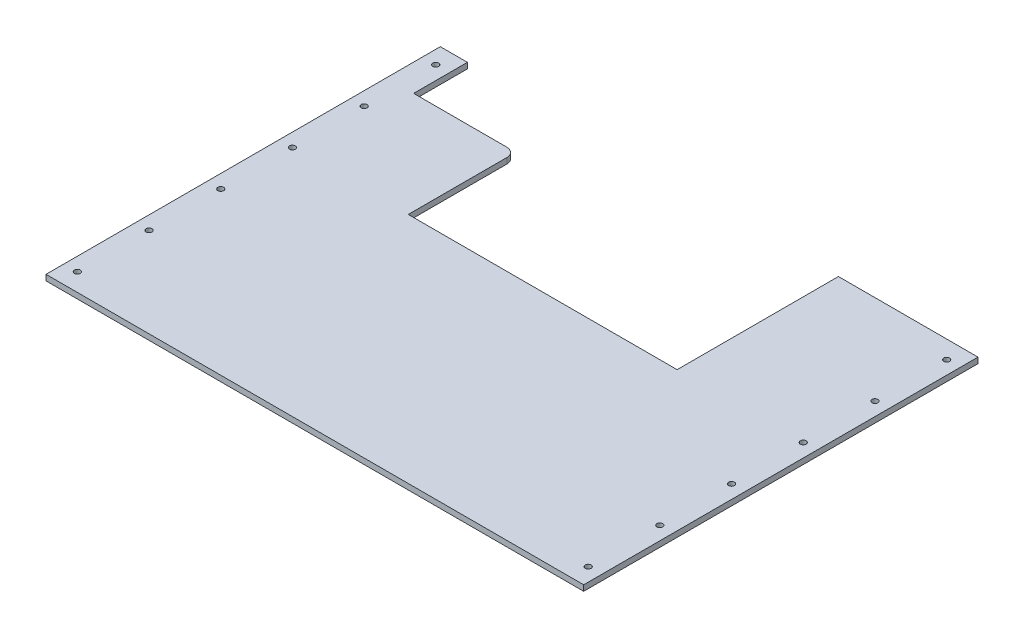
ISO-10303-21;
HEADER;
FILE_DESCRIPTION(('STEP AP214'),'2;1');
FILE_NAME('part.step','',(''),(''),'','','');
FILE_SCHEMA(('AUTOMOTIVE_DESIGN { 1 0 10303 214 1 1 1 1 }'));
ENDSEC;
DATA;
#1=APPLICATION_CONTEXT('core data for automotive mechanical design processes');
#2=APPLICATION_PROTOCOL_DEFINITION('international standard','automotive_design',2000,#1);
#3=PRODUCT_CONTEXT('',#1,'mechanical');
#4=PRODUCT('Part','Part','',(#3));
#5=PRODUCT_RELATED_PRODUCT_CATEGORY('part','',(#4));
#6=PRODUCT_DEFINITION_FORMATION('','',#4);
#7=PRODUCT_DEFINITION_CONTEXT('part definition',#1,'design');
#8=PRODUCT_DEFINITION('design','',#6,#7);
#9=PRODUCT_DEFINITION_SHAPE('','',#8);
#10=(LENGTH_UNIT() NAMED_UNIT(*) SI_UNIT(.MILLI.,.METRE.));
#11=(NAMED_UNIT(*) PLANE_ANGLE_UNIT() SI_UNIT($,.RADIAN.));
#12=(NAMED_UNIT(*) SI_UNIT($,.STERADIAN.) SOLID_ANGLE_UNIT());
#13=UNCERTAINTY_MEASURE_WITH_UNIT(LENGTH_MEASURE(1.E-05),#10,'distance_accuracy_value','');
#14=(GEOMETRIC_REPRESENTATION_CONTEXT(3) GLOBAL_UNCERTAINTY_ASSIGNED_CONTEXT((#13)) GLOBAL_UNIT_ASSIGNED_CONTEXT((#10,
#11,#12)) REPRESENTATION_CONTEXT('',''));
#15=CARTESIAN_POINT('',(0.,0.,0.));
#16=DIRECTION('',(0.,0.,1.));
#17=DIRECTION('',(1.,0.,0.));
#18=AXIS2_PLACEMENT_3D('',#15,#16,#17);
#19=CARTESIAN_POINT('',(-150.,3.18,-91.8553235538784));
#20=DIRECTION('',(1.,0.,0.));
#21=DIRECTION('',(0.,0.,-1.));
#22=AXIS2_PLACEMENT_3D('',#19,#20,#21);
#23=PLANE('',#22);
#24=DIRECTION('',(0.,0.,1.));
#25=VECTOR('',#24,1.);
#26=CARTESIAN_POINT('',(-150.,0.,-91.8553235538784));
#27=LINE('',#26,#25);
#28=CARTESIAN_POINT('',(-150.,0.,-91.8553235538784));
#29=VERTEX_POINT('',#28);
#30=CARTESIAN_POINT('',(-150.,0.,128.144676446122));
#31=VERTEX_POINT('',#30);
#32=EDGE_CURVE('E142',#29,#31,#27,.T.);
#33=ORIENTED_EDGE('',*,*,#32,.T.);
#34=DIRECTION('',(0.,-1.,0.));
#35=VECTOR('',#34,1.);
#36=CARTESIAN_POINT('',(-150.,3.18,128.144676446122));
#37=LINE('',#36,#35);
#38=CARTESIAN_POINT('',(-150.,3.18,128.144676446122));
#39=VERTEX_POINT('',#38);
#40=EDGE_CURVE('E123',#39,#31,#37,.T.);
#41=ORIENTED_EDGE('',*,*,#40,.F.);
#42=DIRECTION('',(0.,0.,1.));
#43=VECTOR('',#42,1.);
#44=CARTESIAN_POINT('',(-150.,3.18,-91.8553235538784));
#45=LINE('',#44,#43);
#46=CARTESIAN_POINT('',(-150.,3.18,-91.8553235538784));
#47=VERTEX_POINT('',#46);
#48=EDGE_CURVE('E130',#47,#39,#45,.T.);
#49=ORIENTED_EDGE('',*,*,#48,.F.);
#50=DIRECTION('',(0.,-1.,0.));
#51=VECTOR('',#50,1.);
#52=CARTESIAN_POINT('',(-150.,3.18,-91.8553235538784));
#53=LINE('',#52,#51);
#54=EDGE_CURVE('E211',#47,#29,#53,.T.);
#55=ORIENTED_EDGE('',*,*,#54,.T.);
#56=EDGE_LOOP('',(#33,#41,#49,#55));
#57=FACE_BOUND('',#56,.T.);
#58=ADVANCED_FACE('F36',(#57),#23,.F.);
#59=CARTESIAN_POINT('',(-150.,3.18,128.144676446122));
#60=DIRECTION('',(0.,0.,-1.));
#61=DIRECTION('',(-1.,0.,0.));
#62=AXIS2_PLACEMENT_3D('',#59,#60,#61);
#63=PLANE('',#62);
#64=DIRECTION('',(1.,0.,0.));
#65=VECTOR('',#64,1.);
#66=CARTESIAN_POINT('',(-150.,0.,128.144676446122));
#67=LINE('',#66,#65);
#68=CARTESIAN_POINT('',(150.,0.,128.144676446122));
#69=VERTEX_POINT('',#68);
#70=EDGE_CURVE('E190',#31,#69,#67,.T.);
#71=ORIENTED_EDGE('',*,*,#70,.T.);
#72=DIRECTION('',(0.,-1.,0.));
#73=VECTOR('',#72,1.);
#74=CARTESIAN_POINT('',(150.,3.18,128.144676446122));
#75=LINE('',#74,#73);
#76=CARTESIAN_POINT('',(150.,3.18,128.144676446122));
#77=VERTEX_POINT('',#76);
#78=EDGE_CURVE('E126',#77,#69,#75,.T.);
#79=ORIENTED_EDGE('',*,*,#78,.F.);
#80=DIRECTION('',(1.,0.,0.));
#81=VECTOR('',#80,1.);
#82=CARTESIAN_POINT('',(-150.,3.18,128.144676446122));
#83=LINE('',#82,#81);
#84=EDGE_CURVE('E119',#39,#77,#83,.T.);
#85=ORIENTED_EDGE('',*,*,#84,.F.);
#86=ORIENTED_EDGE('',*,*,#40,.T.);
#87=EDGE_LOOP('',(#71,#79,#85,#86));
#88=FACE_BOUND('',#87,.T.);
#89=ADVANCED_FACE('F121',(#88),#63,.F.);
#90=CARTESIAN_POINT('',(150.,3.18,-91.8553235538784));
#91=DIRECTION('',(-1.,0.,0.));
#92=DIRECTION('',(0.,0.,1.));
#93=AXIS2_PLACEMENT_3D('',#90,#91,#92);
#94=PLANE('',#93);
#95=DIRECTION('',(0.,0.,-1.));
#96=VECTOR('',#95,1.);
#97=CARTESIAN_POINT('',(150.,0.,-91.8553235538784));
#98=LINE('',#97,#96);
#99=CARTESIAN_POINT('',(150.,0.,-91.8553235538784));
#100=VERTEX_POINT('',#99);
#101=EDGE_CURVE('E192',#69,#100,#98,.T.);
#102=ORIENTED_EDGE('',*,*,#101,.T.);
#103=DIRECTION('',(0.,-1.,0.));
#104=VECTOR('',#103,1.);
#105=CARTESIAN_POINT('',(150.,3.18,-91.8553235538784));
#106=LINE('',#105,#104);
#107=CARTESIAN_POINT('',(150.,3.18,-91.8553235538784));
#108=VERTEX_POINT('',#107);
#109=EDGE_CURVE('E147',#108,#100,#106,.T.);
#110=ORIENTED_EDGE('',*,*,#109,.F.);
#111=DIRECTION('',(0.,0.,-1.));
#112=VECTOR('',#111,1.);
#113=CARTESIAN_POINT('',(150.,3.18,-91.8553235538784));
#114=LINE('',#113,#112);
#115=EDGE_CURVE('E129',#77,#108,#114,.T.);
#116=ORIENTED_EDGE('',*,*,#115,.F.);
#117=ORIENTED_EDGE('',*,*,#78,.T.);
#118=EDGE_LOOP('',(#102,#110,#116,#117));
#119=FACE_BOUND('',#118,.T.);
#120=ADVANCED_FACE('F268',(#119),#94,.F.);
#121=CARTESIAN_POINT('',(72.127496387084,3.18,-91.8553235538784));
#122=DIRECTION('',(0.,0.,1.));
#123=DIRECTION('',(1.,0.,0.));
#124=AXIS2_PLACEMENT_3D('',#121,#122,#123);
#125=PLANE('',#124);
#126=DIRECTION('',(-1.,0.,0.));
#127=VECTOR('',#126,1.);
#128=CARTESIAN_POINT('',(72.127496387084,0.,-91.8553235538784));
#129=LINE('',#128,#127);
#130=CARTESIAN_POINT('',(72.127496387084,0.,-91.8553235538784));
#131=VERTEX_POINT('',#130);
#132=EDGE_CURVE('E198',#100,#131,#129,.T.);
#133=ORIENTED_EDGE('',*,*,#132,.T.);
#134=DIRECTION('',(0.,-1.,0.));
#135=VECTOR('',#134,1.);
#136=CARTESIAN_POINT('',(72.127496387084,3.18,-91.8553235538784));
#137=LINE('',#136,#135);
#138=CARTESIAN_POINT('',(72.127496387084,3.18,-91.8553235538784));
#139=VERTEX_POINT('',#138);
#140=EDGE_CURVE('E225',#139,#131,#137,.T.);
#141=ORIENTED_EDGE('',*,*,#140,.F.);
#142=DIRECTION('',(-1.,0.,0.));
#143=VECTOR('',#142,1.);
#144=CARTESIAN_POINT('',(72.127496387084,3.18,-91.8553235538784));
#145=LINE('',#144,#143);
#146=EDGE_CURVE('E234',#108,#139,#145,.T.);
#147=ORIENTED_EDGE('',*,*,#146,.F.);
#148=ORIENTED_EDGE('',*,*,#109,.T.);
#149=EDGE_LOOP('',(#133,#141,#147,#148));
#150=FACE_BOUND('',#149,.T.);
#151=ADVANCED_FACE('F232',(#150),#125,.F.);
#152=CARTESIAN_POINT('',(72.127496387084,3.18,-91.8553235538784));
#153=DIRECTION('',(1.,0.,0.));
#154=DIRECTION('',(0.,0.,-1.));
#155=AXIS2_PLACEMENT_3D('',#152,#153,#154);
#156=PLANE('',#155);
#157=DIRECTION('',(0.,0.,1.));
#158=VECTOR('',#157,1.);
#159=CARTESIAN_POINT('',(72.127496387084,0.,-91.8553235538784));
#160=LINE('',#159,#158);
#161=CARTESIAN_POINT('',(72.127496387084,0.,-1.85532355387838));
#162=VERTEX_POINT('',#161);
#163=EDGE_CURVE('E200',#131,#162,#160,.T.);
#164=ORIENTED_EDGE('',*,*,#163,.T.);
#165=DIRECTION('',(0.,-1.,0.));
#166=VECTOR('',#165,1.);
#167=CARTESIAN_POINT('',(72.127496387084,3.18,-1.85532355387838));
#168=LINE('',#167,#166);
#169=CARTESIAN_POINT('',(72.127496387084,3.18,-1.85532355387838));
#170=VERTEX_POINT('',#169);
#171=EDGE_CURVE('E222',#170,#162,#168,.T.);
#172=ORIENTED_EDGE('',*,*,#171,.F.);
#173=DIRECTION('',(0.,0.,1.));
#174=VECTOR('',#173,1.);
#175=CARTESIAN_POINT('',(72.127496387084,3.18,-91.8553235538784));
#176=LINE('',#175,#174);
#177=EDGE_CURVE('E250',#139,#170,#176,.T.);
#178=ORIENTED_EDGE('',*,*,#177,.F.);
#179=ORIENTED_EDGE('',*,*,#140,.T.);
#180=EDGE_LOOP('',(#164,#172,#178,#179));
#181=FACE_BOUND('',#180,.T.);
#182=ADVANCED_FACE('F242',(#181),#156,.F.);
#183=CARTESIAN_POINT('',(72.127496387084,3.18,-1.85532355387838));
#184=DIRECTION('',(0.,0.,1.));
#185=DIRECTION('',(1.,0.,0.));
#186=AXIS2_PLACEMENT_3D('',#183,#184,#185);
#187=PLANE('',#186);
#188=DIRECTION('',(-1.,0.,0.));
#189=VECTOR('',#188,1.);
#190=CARTESIAN_POINT('',(72.127496387084,0.,-1.85532355387838));
#191=LINE('',#190,#189);
#192=CARTESIAN_POINT('',(-77.872503612916,0.,-1.85532355387836));
#193=VERTEX_POINT('',#192);
#194=EDGE_CURVE('E202',#162,#193,#191,.T.);
#195=ORIENTED_EDGE('',*,*,#194,.T.);
#196=DIRECTION('',(0.,-1.,0.));
#197=VECTOR('',#196,1.);
#198=CARTESIAN_POINT('',(-77.872503612916,3.18,-1.85532355387836));
#199=LINE('',#198,#197);
#200=CARTESIAN_POINT('',(-77.872503612916,3.18,-1.85532355387836));
#201=VERTEX_POINT('',#200);
#202=EDGE_CURVE('E219',#201,#193,#199,.T.);
#203=ORIENTED_EDGE('',*,*,#202,.F.);
#204=DIRECTION('',(-1.,0.,0.));
#205=VECTOR('',#204,1.);
#206=CARTESIAN_POINT('',(72.127496387084,3.18,-1.85532355387838));
#207=LINE('',#206,#205);
#208=EDGE_CURVE('E248',#170,#201,#207,.T.);
#209=ORIENTED_EDGE('',*,*,#208,.F.);
#210=ORIENTED_EDGE('',*,*,#171,.T.);
#211=EDGE_LOOP('',(#195,#203,#209,#210));
#212=FACE_BOUND('',#211,.T.);
#213=ADVANCED_FACE('F246',(#212),#187,.F.);
#214=CARTESIAN_POINT('',(-77.872503612916,3.18,-1.85532355387836));
#215=DIRECTION('',(-1.,0.,0.));
#216=DIRECTION('',(0.,0.,1.));
#217=AXIS2_PLACEMENT_3D('',#214,#215,#216);
#218=PLANE('',#217);
#219=DIRECTION('',(0.,0.,-1.));
#220=VECTOR('',#219,1.);
#221=CARTESIAN_POINT('',(-77.872503612916,0.,-1.85532355387836));
#222=LINE('',#221,#220);
#223=CARTESIAN_POINT('',(-77.872503612916,0.,-56.8553235538783));
#224=VERTEX_POINT('',#223);
#225=EDGE_CURVE('E204',#193,#224,#222,.T.);
#226=ORIENTED_EDGE('',*,*,#225,.T.);
#227=DIRECTION('',(0.,-1.,0.));
#228=VECTOR('',#227,1.);
#229=CARTESIAN_POINT('',(-77.872503612916,3.18,-56.8553235538783));
#230=LINE('',#229,#228);
#231=CARTESIAN_POINT('',(-77.872503612916,3.18,-56.8553235538783));
#232=VERTEX_POINT('',#231);
#233=EDGE_CURVE('E44',#224,#232,#230,.F.);
#234=ORIENTED_EDGE('',*,*,#233,.T.);
#235=DIRECTION('',(0.,0.,-1.));
#236=VECTOR('',#235,1.);
#237=CARTESIAN_POINT('',(-77.872503612916,3.18,-1.85532355387836));
#238=LINE('',#237,#236);
#239=EDGE_CURVE('E249',#201,#232,#238,.T.);
#240=ORIENTED_EDGE('',*,*,#239,.F.);
#241=ORIENTED_EDGE('',*,*,#202,.T.);
#242=EDGE_LOOP('',(#226,#234,#240,#241));
#243=FACE_BOUND('',#242,.T.);
#244=ADVANCED_FACE('F347',(#243),#218,.F.);
#245=CARTESIAN_POINT('',(-77.872503612916,3.18,-61.8553235538783));
#246=DIRECTION('',(0.,0.,1.));
#247=DIRECTION('',(1.,0.,0.));
#248=AXIS2_PLACEMENT_3D('',#245,#246,#247);
#249=PLANE('',#248);
#250=DIRECTION('',(-1.,0.,0.));
#251=VECTOR('',#250,1.);
#252=CARTESIAN_POINT('',(-77.872503612916,3.18,-61.8553235538783));
#253=LINE('',#252,#251);
#254=CARTESIAN_POINT('',(-82.872503612916,3.18,-61.8553235538783));
#255=VERTEX_POINT('',#254);
#256=CARTESIAN_POINT('',(-134.872503612916,3.18,-61.8553235538783));
#257=VERTEX_POINT('',#256);
#258=EDGE_CURVE('E252',#255,#257,#253,.T.);
#259=ORIENTED_EDGE('',*,*,#258,.F.);
#260=DIRECTION('',(0.,-1.,0.));
#261=VECTOR('',#260,1.);
#262=CARTESIAN_POINT('',(-82.872503612916,3.18,-61.8553235538783));
#263=LINE('',#262,#261);
#264=CARTESIAN_POINT('',(-82.872503612916,0.,-61.8553235538783));
#265=VERTEX_POINT('',#264);
#266=EDGE_CURVE('E143',#255,#265,#263,.T.);
#267=ORIENTED_EDGE('',*,*,#266,.T.);
#268=DIRECTION('',(-1.,0.,0.));
#269=VECTOR('',#268,1.);
#270=CARTESIAN_POINT('',(-77.872503612916,0.,-61.8553235538783));
#271=LINE('',#270,#269);
#272=CARTESIAN_POINT('',(-134.872503612916,0.,-61.8553235538783));
#273=VERTEX_POINT('',#272);
#274=EDGE_CURVE('E206',#265,#273,#271,.T.);
#275=ORIENTED_EDGE('',*,*,#274,.T.);
#276=DIRECTION('',(0.,-1.,0.));
#277=VECTOR('',#276,1.);
#278=CARTESIAN_POINT('',(-134.872503612916,3.18,-61.8553235538783));
#279=LINE('',#278,#277);
#280=EDGE_CURVE('E216',#257,#273,#279,.T.);
#281=ORIENTED_EDGE('',*,*,#280,.F.);
#282=EDGE_LOOP('',(#259,#267,#275,#281));
#283=FACE_BOUND('',#282,.T.);
#284=ADVANCED_FACE('F350',(#283),#249,.F.);
#285=CARTESIAN_POINT('',(-134.872503612916,3.18,-61.8553235538783));
#286=DIRECTION('',(-1.,0.,0.));
#287=DIRECTION('',(0.,0.,1.));
#288=AXIS2_PLACEMENT_3D('',#285,#286,#287);
#289=PLANE('',#288);
#290=DIRECTION('',(0.,0.,-1.));
#291=VECTOR('',#290,1.);
#292=CARTESIAN_POINT('',(-134.872503612916,0.,-61.8553235538783));
#293=LINE('',#292,#291);
#294=CARTESIAN_POINT('',(-134.872503612916,0.,-91.8553235538784));
#295=VERTEX_POINT('',#294);
#296=EDGE_CURVE('E208',#273,#295,#293,.T.);
#297=ORIENTED_EDGE('',*,*,#296,.T.);
#298=DIRECTION('',(0.,-1.,0.));
#299=VECTOR('',#298,1.);
#300=CARTESIAN_POINT('',(-134.872503612916,3.18,-91.8553235538784));
#301=LINE('',#300,#299);
#302=CARTESIAN_POINT('',(-134.872503612916,3.18,-91.8553235538784));
#303=VERTEX_POINT('',#302);
#304=EDGE_CURVE('E213',#303,#295,#301,.T.);
#305=ORIENTED_EDGE('',*,*,#304,.F.);
#306=DIRECTION('',(0.,0.,-1.));
#307=VECTOR('',#306,1.);
#308=CARTESIAN_POINT('',(-134.872503612916,3.18,-61.8553235538783));
#309=LINE('',#308,#307);
#310=EDGE_CURVE('E257',#257,#303,#309,.T.);
#311=ORIENTED_EDGE('',*,*,#310,.F.);
#312=ORIENTED_EDGE('',*,*,#280,.T.);
#313=EDGE_LOOP('',(#297,#305,#311,#312));
#314=FACE_BOUND('',#313,.T.);
#315=ADVANCED_FACE('F263',(#314),#289,.F.);
#316=CARTESIAN_POINT('',(-150.,3.18,-91.8553235538784));
#317=DIRECTION('',(0.,0.,1.));
#318=DIRECTION('',(1.,0.,0.));
#319=AXIS2_PLACEMENT_3D('',#316,#317,#318);
#320=PLANE('',#319);
#321=DIRECTION('',(-1.,0.,0.));
#322=VECTOR('',#321,1.);
#323=CARTESIAN_POINT('',(-150.,0.,-91.8553235538784));
#324=LINE('',#323,#322);
#325=EDGE_CURVE('E139',#295,#29,#324,.T.);
#326=ORIENTED_EDGE('',*,*,#325,.T.);
#327=ORIENTED_EDGE('',*,*,#54,.F.);
#328=DIRECTION('',(-1.,0.,0.));
#329=VECTOR('',#328,1.);
#330=CARTESIAN_POINT('',(-150.,3.18,-91.8553235538784));
#331=LINE('',#330,#329);
#332=EDGE_CURVE('E135',#303,#47,#331,.T.);
#333=ORIENTED_EDGE('',*,*,#332,.F.);
#334=ORIENTED_EDGE('',*,*,#304,.T.);
#335=EDGE_LOOP('',(#326,#327,#333,#334));
#336=FACE_BOUND('',#335,.T.);
#337=ADVANCED_FACE('F267',(#336),#320,.F.);
#338=CARTESIAN_POINT('',(0.,3.18,0.));
#339=DIRECTION('',(0.,1.,0.));
#340=DIRECTION('',(0.,0.,1.));
#341=AXIS2_PLACEMENT_3D('',#338,#339,#340);
#342=PLANE('',#341);
#343=CARTESIAN_POINT('',(-142.499999999998,3.18,118.144676446122));
#344=DIRECTION('',(0.,1.,0.));
#345=DIRECTION('',(0.,0.,1.));
#346=AXIS2_PLACEMENT_3D('',#343,#344,#345);
#347=CIRCLE('',#346,1.65000000000002);
#348=CARTESIAN_POINT('',(-142.499999999998,3.18,119.794676446122));
#349=VERTEX_POINT('',#348);
#350=EDGE_CURVE('E278',#349,#349,#347,.T.);
#351=ORIENTED_EDGE('',*,*,#350,.F.);
#352=EDGE_LOOP('',(#351));
#353=FACE_BOUND('',#352,.T.);
#354=CARTESIAN_POINT('',(142.5,3.18,-81.8553235538784));
#355=DIRECTION('',(0.,1.,0.));
#356=DIRECTION('',(0.,0.,1.));
#357=AXIS2_PLACEMENT_3D('',#354,#355,#356);
#358=CIRCLE('',#357,1.65000000000002);
#359=CARTESIAN_POINT('',(142.5,3.18,-80.2053235538784));
#360=VERTEX_POINT('',#359);
#361=EDGE_CURVE('E286',#360,#360,#358,.T.);
#362=ORIENTED_EDGE('',*,*,#361,.F.);
#363=EDGE_LOOP('',(#362));
#364=FACE_BOUND('',#363,.T.);
#365=CARTESIAN_POINT('',(142.500000000001,3.18,-41.8553235538784));
#366=DIRECTION('',(0.,1.,0.));
#367=DIRECTION('',(0.,0.,1.));
#368=AXIS2_PLACEMENT_3D('',#365,#366,#367);
#369=CIRCLE('',#368,1.65000000000002);
#370=CARTESIAN_POINT('',(142.500000000001,3.18,-40.2053235538784));
#371=VERTEX_POINT('',#370);
#372=EDGE_CURVE('E289',#371,#371,#369,.T.);
#373=ORIENTED_EDGE('',*,*,#372,.F.);
#374=EDGE_LOOP('',(#373));
#375=FACE_BOUND('',#374,.T.);
#376=CARTESIAN_POINT('',(142.500000000001,3.18,-1.85532355387838));
#377=DIRECTION('',(0.,1.,0.));
#378=DIRECTION('',(0.,0.,1.));
#379=AXIS2_PLACEMENT_3D('',#376,#377,#378);
#380=CIRCLE('',#379,1.65000000000002);
#381=CARTESIAN_POINT('',(142.500000000001,3.18,-0.205323553878363));
#382=VERTEX_POINT('',#381);
#383=EDGE_CURVE('E292',#382,#382,#380,.T.);
#384=ORIENTED_EDGE('',*,*,#383,.F.);
#385=EDGE_LOOP('',(#384));
#386=FACE_BOUND('',#385,.T.);
#387=CARTESIAN_POINT('',(-142.499999999998,3.18,78.1446764461216));
#388=DIRECTION('',(0.,1.,0.));
#389=DIRECTION('',(0.,0.,1.));
#390=AXIS2_PLACEMENT_3D('',#387,#388,#389);
#391=CIRCLE('',#390,1.65000000000002);
#392=CARTESIAN_POINT('',(-142.499999999998,3.18,79.7946764461216));
#393=VERTEX_POINT('',#392);
#394=EDGE_CURVE('E274',#393,#393,#391,.T.);
#395=ORIENTED_EDGE('',*,*,#394,.F.);
#396=EDGE_LOOP('',(#395));
#397=FACE_BOUND('',#396,.T.);
#398=CARTESIAN_POINT('',(-142.499999999999,3.18,38.1446764461216));
#399=DIRECTION('',(0.,1.,0.));
#400=DIRECTION('',(0.,0.,1.));
#401=AXIS2_PLACEMENT_3D('',#398,#399,#400);
#402=CIRCLE('',#401,1.65000000000002);
#403=CARTESIAN_POINT('',(-142.499999999999,3.18,39.7946764461216));
#404=VERTEX_POINT('',#403);
#405=EDGE_CURVE('E277',#404,#404,#402,.T.);
#406=ORIENTED_EDGE('',*,*,#405,.F.);
#407=EDGE_LOOP('',(#406));
#408=FACE_BOUND('',#407,.T.);
#409=CARTESIAN_POINT('',(-142.499999999999,3.18,-1.85532355387838));
#410=DIRECTION('',(0.,1.,0.));
#411=DIRECTION('',(0.,0.,1.));
#412=AXIS2_PLACEMENT_3D('',#409,#410,#411);
#413=CIRCLE('',#412,1.65000000000002);
#414=CARTESIAN_POINT('',(-142.499999999999,3.18,-0.205323553878363));
#415=VERTEX_POINT('',#414);
#416=EDGE_CURVE('E281',#415,#415,#413,.T.);
#417=ORIENTED_EDGE('',*,*,#416,.F.);
#418=EDGE_LOOP('',(#417));
#419=FACE_BOUND('',#418,.T.);
#420=CARTESIAN_POINT('',(-142.499999999999,3.18,-41.8553235538784));
#421=DIRECTION('',(0.,1.,0.));
#422=DIRECTION('',(0.,0.,1.));
#423=AXIS2_PLACEMENT_3D('',#420,#421,#422);
#424=CIRCLE('',#423,1.65000000000002);
#425=CARTESIAN_POINT('',(-142.499999999999,3.18,-40.2053235538784));
#426=VERTEX_POINT('',#425);
#427=EDGE_CURVE('E273',#426,#426,#424,.T.);
#428=ORIENTED_EDGE('',*,*,#427,.F.);
#429=EDGE_LOOP('',(#428));
#430=FACE_BOUND('',#429,.T.);
#431=CARTESIAN_POINT('',(142.500000000001,3.18,38.1446764461216));
#432=DIRECTION('',(0.,1.,0.));
#433=DIRECTION('',(0.,0.,1.));
#434=AXIS2_PLACEMENT_3D('',#431,#432,#433);
#435=CIRCLE('',#434,1.65000000000002);
#436=CARTESIAN_POINT('',(142.500000000001,3.18,39.7946764461216));
#437=VERTEX_POINT('',#436);
#438=EDGE_CURVE('E295',#437,#437,#435,.T.);
#439=ORIENTED_EDGE('',*,*,#438,.F.);
#440=EDGE_LOOP('',(#439));
#441=FACE_BOUND('',#440,.T.);
#442=CARTESIAN_POINT('',(142.500000000002,3.18,78.1446764461216));
#443=DIRECTION('',(0.,1.,0.));
#444=DIRECTION('',(0.,0.,1.));
#445=AXIS2_PLACEMENT_3D('',#442,#443,#444);
#446=CIRCLE('',#445,1.65000000000002);
#447=CARTESIAN_POINT('',(142.500000000002,3.18,79.7946764461216));
#448=VERTEX_POINT('',#447);
#449=EDGE_CURVE('E301',#448,#448,#446,.T.);
#450=ORIENTED_EDGE('',*,*,#449,.F.);
#451=EDGE_LOOP('',(#450));
#452=FACE_BOUND('',#451,.T.);
#453=CARTESIAN_POINT('',(142.500000000002,3.18,118.144676446122));
#454=DIRECTION('',(0.,1.,0.));
#455=DIRECTION('',(0.,0.,1.));
#456=AXIS2_PLACEMENT_3D('',#453,#454,#455);
#457=CIRCLE('',#456,1.65000000000002);
#458=CARTESIAN_POINT('',(142.500000000002,3.18,119.794676446122));
#459=VERTEX_POINT('',#458);
#460=EDGE_CURVE('E298',#459,#459,#457,.T.);
#461=ORIENTED_EDGE('',*,*,#460,.F.);
#462=EDGE_LOOP('',(#461));
#463=FACE_BOUND('',#462,.T.);
#464=CARTESIAN_POINT('',(-142.5,3.18,-81.8553235538784));
#465=DIRECTION('',(0.,1.,0.));
#466=DIRECTION('',(0.,0.,1.));
#467=AXIS2_PLACEMENT_3D('',#464,#465,#466);
#468=CIRCLE('',#467,1.65000000000002);
#469=CARTESIAN_POINT('',(-142.5,3.18,-80.2053235538784));
#470=VERTEX_POINT('',#469);
#471=EDGE_CURVE('E155',#470,#470,#468,.T.);
#472=ORIENTED_EDGE('',*,*,#471,.F.);
#473=EDGE_LOOP('',(#472));
#474=FACE_BOUND('',#473,.T.);
#475=ORIENTED_EDGE('',*,*,#239,.T.);
#476=CARTESIAN_POINT('',(-82.872503612916,3.18,-56.8553235538783));
#477=DIRECTION('',(0.,1.,0.));
#478=DIRECTION('',(0.,0.,1.));
#479=AXIS2_PLACEMENT_3D('',#476,#477,#478);
#480=CIRCLE('',#479,5.);
#481=EDGE_CURVE('E11',#232,#255,#480,.T.);
#482=ORIENTED_EDGE('',*,*,#481,.T.);
#483=ORIENTED_EDGE('',*,*,#258,.T.);
#484=ORIENTED_EDGE('',*,*,#310,.T.);
#485=ORIENTED_EDGE('',*,*,#332,.T.);
#486=ORIENTED_EDGE('',*,*,#48,.T.);
#487=ORIENTED_EDGE('',*,*,#84,.T.);
#488=ORIENTED_EDGE('',*,*,#115,.T.);
#489=ORIENTED_EDGE('',*,*,#146,.T.);
#490=ORIENTED_EDGE('',*,*,#177,.T.);
#491=ORIENTED_EDGE('',*,*,#208,.T.);
#492=EDGE_LOOP('',(#475,#482,#483,#484,#485,#486,#487,#488,#489,#490,#491));
#493=FACE_BOUND('',#492,.T.);
#494=ADVANCED_FACE('F133',(#353,#364,#375,#386,#397,#408,#419,#430,#441,#452,#463,#474,#493),
#342,.T.);
#495=CARTESIAN_POINT('',(0.,0.,0.));
#496=DIRECTION('',(0.,1.,0.));
#497=DIRECTION('',(0.,0.,1.));
#498=AXIS2_PLACEMENT_3D('',#495,#496,#497);
#499=PLANE('',#498);
#500=CARTESIAN_POINT('',(-142.499999999998,0.,118.144676446122));
#501=DIRECTION('',(0.,1.,0.));
#502=DIRECTION('',(0.,0.,1.));
#503=AXIS2_PLACEMENT_3D('',#500,#501,#502);
#504=CIRCLE('',#503,1.65000000000002);
#505=CARTESIAN_POINT('',(-142.499999999998,0.,119.794676446122));
#506=VERTEX_POINT('',#505);
#507=EDGE_CURVE('E185',#506,#506,#504,.T.);
#508=ORIENTED_EDGE('',*,*,#507,.T.);
#509=EDGE_LOOP('',(#508));
#510=FACE_BOUND('',#509,.T.);
#511=CARTESIAN_POINT('',(142.5,0.,-81.8553235538784));
#512=DIRECTION('',(0.,1.,0.));
#513=DIRECTION('',(0.,0.,1.));
#514=AXIS2_PLACEMENT_3D('',#511,#512,#513);
#515=CIRCLE('',#514,1.65000000000002);
#516=CARTESIAN_POINT('',(142.5,0.,-80.2053235538784));
#517=VERTEX_POINT('',#516);
#518=EDGE_CURVE('E182',#517,#517,#515,.T.);
#519=ORIENTED_EDGE('',*,*,#518,.T.);
#520=EDGE_LOOP('',(#519));
#521=FACE_BOUND('',#520,.T.);
#522=CARTESIAN_POINT('',(142.500000000001,0.,-41.8553235538784));
#523=DIRECTION('',(0.,1.,0.));
#524=DIRECTION('',(0.,0.,1.));
#525=AXIS2_PLACEMENT_3D('',#522,#523,#524);
#526=CIRCLE('',#525,1.65000000000002);
#527=CARTESIAN_POINT('',(142.500000000001,0.,-40.2053235538784));
#528=VERTEX_POINT('',#527);
#529=EDGE_CURVE('E179',#528,#528,#526,.T.);
#530=ORIENTED_EDGE('',*,*,#529,.T.);
#531=EDGE_LOOP('',(#530));
#532=FACE_BOUND('',#531,.T.);
#533=CARTESIAN_POINT('',(142.500000000001,0.,-1.85532355387838));
#534=DIRECTION('',(0.,1.,0.));
#535=DIRECTION('',(0.,0.,1.));
#536=AXIS2_PLACEMENT_3D('',#533,#534,#535);
#537=CIRCLE('',#536,1.65000000000002);
#538=CARTESIAN_POINT('',(142.500000000001,0.,-0.205323553878363));
#539=VERTEX_POINT('',#538);
#540=EDGE_CURVE('E176',#539,#539,#537,.T.);
#541=ORIENTED_EDGE('',*,*,#540,.T.);
#542=EDGE_LOOP('',(#541));
#543=FACE_BOUND('',#542,.T.);
#544=CARTESIAN_POINT('',(-142.499999999998,0.,78.1446764461216));
#545=DIRECTION('',(0.,1.,0.));
#546=DIRECTION('',(0.,0.,1.));
#547=AXIS2_PLACEMENT_3D('',#544,#545,#546);
#548=CIRCLE('',#547,1.65000000000002);
#549=CARTESIAN_POINT('',(-142.499999999998,0.,79.7946764461216));
#550=VERTEX_POINT('',#549);
#551=EDGE_CURVE('E173',#550,#550,#548,.T.);
#552=ORIENTED_EDGE('',*,*,#551,.T.);
#553=EDGE_LOOP('',(#552));
#554=FACE_BOUND('',#553,.T.);
#555=CARTESIAN_POINT('',(-142.499999999999,0.,38.1446764461216));
#556=DIRECTION('',(0.,1.,0.));
#557=DIRECTION('',(0.,0.,1.));
#558=AXIS2_PLACEMENT_3D('',#555,#556,#557);
#559=CIRCLE('',#558,1.65000000000002);
#560=CARTESIAN_POINT('',(-142.499999999999,0.,39.7946764461216));
#561=VERTEX_POINT('',#560);
#562=EDGE_CURVE('E170',#561,#561,#559,.T.);
#563=ORIENTED_EDGE('',*,*,#562,.T.);
#564=EDGE_LOOP('',(#563));
#565=FACE_BOUND('',#564,.T.);
#566=CARTESIAN_POINT('',(-142.499999999999,0.,-1.85532355387838));
#567=DIRECTION('',(0.,1.,0.));
#568=DIRECTION('',(0.,0.,1.));
#569=AXIS2_PLACEMENT_3D('',#566,#567,#568);
#570=CIRCLE('',#569,1.65000000000002);
#571=CARTESIAN_POINT('',(-142.499999999999,0.,-0.205323553878363));
#572=VERTEX_POINT('',#571);
#573=EDGE_CURVE('E167',#572,#572,#570,.T.);
#574=ORIENTED_EDGE('',*,*,#573,.T.);
#575=EDGE_LOOP('',(#574));
#576=FACE_BOUND('',#575,.T.);
#577=CARTESIAN_POINT('',(-142.499999999999,0.,-41.8553235538784));
#578=DIRECTION('',(0.,1.,0.));
#579=DIRECTION('',(0.,0.,1.));
#580=AXIS2_PLACEMENT_3D('',#577,#578,#579);
#581=CIRCLE('',#580,1.65000000000002);
#582=CARTESIAN_POINT('',(-142.499999999999,0.,-40.2053235538784));
#583=VERTEX_POINT('',#582);
#584=EDGE_CURVE('E164',#583,#583,#581,.T.);
#585=ORIENTED_EDGE('',*,*,#584,.T.);
#586=EDGE_LOOP('',(#585));
#587=FACE_BOUND('',#586,.T.);
#588=CARTESIAN_POINT('',(142.500000000001,0.,38.1446764461216));
#589=DIRECTION('',(0.,1.,0.));
#590=DIRECTION('',(0.,0.,1.));
#591=AXIS2_PLACEMENT_3D('',#588,#589,#590);
#592=CIRCLE('',#591,1.65000000000002);
#593=CARTESIAN_POINT('',(142.500000000001,0.,39.7946764461216));
#594=VERTEX_POINT('',#593);
#595=EDGE_CURVE('E161',#594,#594,#592,.T.);
#596=ORIENTED_EDGE('',*,*,#595,.T.);
#597=EDGE_LOOP('',(#596));
#598=FACE_BOUND('',#597,.T.);
#599=CARTESIAN_POINT('',(142.500000000002,0.,78.1446764461216));
#600=DIRECTION('',(0.,1.,0.));
#601=DIRECTION('',(0.,0.,1.));
#602=AXIS2_PLACEMENT_3D('',#599,#600,#601);
#603=CIRCLE('',#602,1.65000000000002);
#604=CARTESIAN_POINT('',(142.500000000002,0.,79.7946764461216));
#605=VERTEX_POINT('',#604);
#606=EDGE_CURVE('E158',#605,#605,#603,.T.);
#607=ORIENTED_EDGE('',*,*,#606,.T.);
#608=EDGE_LOOP('',(#607));
#609=FACE_BOUND('',#608,.T.);
#610=CARTESIAN_POINT('',(142.500000000002,0.,118.144676446122));
#611=DIRECTION('',(0.,1.,0.));
#612=DIRECTION('',(0.,0.,1.));
#613=AXIS2_PLACEMENT_3D('',#610,#611,#612);
#614=CIRCLE('',#613,1.65000000000002);
#615=CARTESIAN_POINT('',(142.500000000002,0.,119.794676446122));
#616=VERTEX_POINT('',#615);
#617=EDGE_CURVE('E154',#616,#616,#614,.T.);
#618=ORIENTED_EDGE('',*,*,#617,.T.);
#619=EDGE_LOOP('',(#618));
#620=FACE_BOUND('',#619,.T.);
#621=CARTESIAN_POINT('',(-142.5,0.,-81.8553235538784));
#622=DIRECTION('',(0.,1.,0.));
#623=DIRECTION('',(0.,0.,1.));
#624=AXIS2_PLACEMENT_3D('',#621,#622,#623);
#625=CIRCLE('',#624,1.65000000000002);
#626=CARTESIAN_POINT('',(-142.5,0.,-80.2053235538784));
#627=VERTEX_POINT('',#626);
#628=EDGE_CURVE('E151',#627,#627,#625,.T.);
#629=ORIENTED_EDGE('',*,*,#628,.T.);
#630=EDGE_LOOP('',(#629));
#631=FACE_BOUND('',#630,.T.);
#632=ORIENTED_EDGE('',*,*,#274,.F.);
#633=CARTESIAN_POINT('',(-82.872503612916,0.,-56.8553235538783));
#634=DIRECTION('',(0.,1.,0.));
#635=DIRECTION('',(0.,0.,1.));
#636=AXIS2_PLACEMENT_3D('',#633,#634,#635);
#637=CIRCLE('',#636,5.);
#638=EDGE_CURVE('E58',#265,#224,#637,.F.);
#639=ORIENTED_EDGE('',*,*,#638,.T.);
#640=ORIENTED_EDGE('',*,*,#225,.F.);
#641=ORIENTED_EDGE('',*,*,#194,.F.);
#642=ORIENTED_EDGE('',*,*,#163,.F.);
#643=ORIENTED_EDGE('',*,*,#132,.F.);
#644=ORIENTED_EDGE('',*,*,#101,.F.);
#645=ORIENTED_EDGE('',*,*,#70,.F.);
#646=ORIENTED_EDGE('',*,*,#32,.F.);
#647=ORIENTED_EDGE('',*,*,#325,.F.);
#648=ORIENTED_EDGE('',*,*,#296,.F.);
#649=EDGE_LOOP('',(#632,#639,#640,#641,#642,#643,#644,#645,#646,#647,#648));
#650=FACE_BOUND('',#649,.T.);
#651=ADVANCED_FACE('F238',(#510,#521,#532,#543,#554,#565,#576,#587,#598,#609,#620,#631,#650),
#499,.F.);
#652=CARTESIAN_POINT('',(-142.5,-6.82,-81.8553235538784));
#653=DIRECTION('',(0.,1.,0.));
#654=DIRECTION('',(0.,0.,1.));
#655=AXIS2_PLACEMENT_3D('',#652,#653,#654);
#656=CYLINDRICAL_SURFACE('',#655,1.65000000000002);
#657=ORIENTED_EDGE('',*,*,#471,.T.);
#658=EDGE_LOOP('',(#657));
#659=FACE_BOUND('',#658,.T.);
#660=ORIENTED_EDGE('',*,*,#628,.F.);
#661=EDGE_LOOP('',(#660));
#662=FACE_BOUND('',#661,.T.);
#663=ADVANCED_FACE('F320',(#659,#662),#656,.F.);
#664=CARTESIAN_POINT('',(142.500000000002,-6.82,118.144676446122));
#665=DIRECTION('',(0.,1.,0.));
#666=DIRECTION('',(0.,0.,1.));
#667=AXIS2_PLACEMENT_3D('',#664,#665,#666);
#668=CYLINDRICAL_SURFACE('',#667,1.65000000000002);
#669=ORIENTED_EDGE('',*,*,#460,.T.);
#670=EDGE_LOOP('',(#669));
#671=FACE_BOUND('',#670,.T.);
#672=ORIENTED_EDGE('',*,*,#617,.F.);
#673=EDGE_LOOP('',(#672));
#674=FACE_BOUND('',#673,.T.);
#675=ADVANCED_FACE('F323',(#671,#674),#668,.F.);
#676=CARTESIAN_POINT('',(142.500000000002,-6.82,78.1446764461216));
#677=DIRECTION('',(0.,1.,0.));
#678=DIRECTION('',(0.,0.,1.));
#679=AXIS2_PLACEMENT_3D('',#676,#677,#678);
#680=CYLINDRICAL_SURFACE('',#679,1.65000000000002);
#681=ORIENTED_EDGE('',*,*,#449,.T.);
#682=EDGE_LOOP('',(#681));
#683=FACE_BOUND('',#682,.T.);
#684=ORIENTED_EDGE('',*,*,#606,.F.);
#685=EDGE_LOOP('',(#684));
#686=FACE_BOUND('',#685,.T.);
#687=ADVANCED_FACE('F454',(#683,#686),#680,.F.);
#688=CARTESIAN_POINT('',(142.500000000001,-6.82,38.1446764461216));
#689=DIRECTION('',(0.,1.,0.));
#690=DIRECTION('',(0.,0.,1.));
#691=AXIS2_PLACEMENT_3D('',#688,#689,#690);
#692=CYLINDRICAL_SURFACE('',#691,1.65000000000002);
#693=ORIENTED_EDGE('',*,*,#438,.T.);
#694=EDGE_LOOP('',(#693));
#695=FACE_BOUND('',#694,.T.);
#696=ORIENTED_EDGE('',*,*,#595,.F.);
#697=EDGE_LOOP('',(#696));
#698=FACE_BOUND('',#697,.T.);
#699=ADVANCED_FACE('F307',(#695,#698),#692,.F.);
#700=CARTESIAN_POINT('',(-142.499999999999,-6.82,-41.8553235538784));
#701=DIRECTION('',(0.,1.,0.));
#702=DIRECTION('',(0.,0.,1.));
#703=AXIS2_PLACEMENT_3D('',#700,#701,#702);
#704=CYLINDRICAL_SURFACE('',#703,1.65000000000002);
#705=ORIENTED_EDGE('',*,*,#427,.T.);
#706=EDGE_LOOP('',(#705));
#707=FACE_BOUND('',#706,.T.);
#708=ORIENTED_EDGE('',*,*,#584,.F.);
#709=EDGE_LOOP('',(#708));
#710=FACE_BOUND('',#709,.T.);
#711=ADVANCED_FACE('F439',(#707,#710),#704,.F.);
#712=CARTESIAN_POINT('',(-142.499999999999,-6.82,-1.85532355387838));
#713=DIRECTION('',(0.,1.,0.));
#714=DIRECTION('',(0.,0.,1.));
#715=AXIS2_PLACEMENT_3D('',#712,#713,#714);
#716=CYLINDRICAL_SURFACE('',#715,1.65000000000002);
#717=ORIENTED_EDGE('',*,*,#416,.T.);
#718=EDGE_LOOP('',(#717));
#719=FACE_BOUND('',#718,.T.);
#720=ORIENTED_EDGE('',*,*,#573,.F.);
#721=EDGE_LOOP('',(#720));
#722=FACE_BOUND('',#721,.T.);
#723=ADVANCED_FACE('F431',(#719,#722),#716,.F.);
#724=CARTESIAN_POINT('',(-142.499999999999,-6.82,38.1446764461216));
#725=DIRECTION('',(0.,1.,0.));
#726=DIRECTION('',(0.,0.,1.));
#727=AXIS2_PLACEMENT_3D('',#724,#725,#726);
#728=CYLINDRICAL_SURFACE('',#727,1.65000000000002);
#729=ORIENTED_EDGE('',*,*,#405,.T.);
#730=EDGE_LOOP('',(#729));
#731=FACE_BOUND('',#730,.T.);
#732=ORIENTED_EDGE('',*,*,#562,.F.);
#733=EDGE_LOOP('',(#732));
#734=FACE_BOUND('',#733,.T.);
#735=ADVANCED_FACE('F423',(#731,#734),#728,.F.);
#736=CARTESIAN_POINT('',(-142.499999999998,-6.82,78.1446764461216));
#737=DIRECTION('',(0.,1.,0.));
#738=DIRECTION('',(0.,0.,1.));
#739=AXIS2_PLACEMENT_3D('',#736,#737,#738);
#740=CYLINDRICAL_SURFACE('',#739,1.65000000000002);
#741=ORIENTED_EDGE('',*,*,#394,.T.);
#742=EDGE_LOOP('',(#741));
#743=FACE_BOUND('',#742,.T.);
#744=ORIENTED_EDGE('',*,*,#551,.F.);
#745=EDGE_LOOP('',(#744));
#746=FACE_BOUND('',#745,.T.);
#747=ADVANCED_FACE('F415',(#743,#746),#740,.F.);
#748=CARTESIAN_POINT('',(142.500000000001,-6.82,-1.85532355387838));
#749=DIRECTION('',(0.,1.,0.));
#750=DIRECTION('',(0.,0.,1.));
#751=AXIS2_PLACEMENT_3D('',#748,#749,#750);
#752=CYLINDRICAL_SURFACE('',#751,1.65000000000002);
#753=ORIENTED_EDGE('',*,*,#383,.T.);
#754=EDGE_LOOP('',(#753));
#755=FACE_BOUND('',#754,.T.);
#756=ORIENTED_EDGE('',*,*,#540,.F.);
#757=EDGE_LOOP('',(#756));
#758=FACE_BOUND('',#757,.T.);
#759=ADVANCED_FACE('F407',(#755,#758),#752,.F.);
#760=CARTESIAN_POINT('',(142.500000000001,-6.82,-41.8553235538784));
#761=DIRECTION('',(0.,1.,0.));
#762=DIRECTION('',(0.,0.,1.));
#763=AXIS2_PLACEMENT_3D('',#760,#761,#762);
#764=CYLINDRICAL_SURFACE('',#763,1.65000000000002);
#765=ORIENTED_EDGE('',*,*,#372,.T.);
#766=EDGE_LOOP('',(#765));
#767=FACE_BOUND('',#766,.T.);
#768=ORIENTED_EDGE('',*,*,#529,.F.);
#769=EDGE_LOOP('',(#768));
#770=FACE_BOUND('',#769,.T.);
#771=ADVANCED_FACE('F399',(#767,#770),#764,.F.);
#772=CARTESIAN_POINT('',(142.5,-6.82,-81.8553235538784));
#773=DIRECTION('',(0.,1.,0.));
#774=DIRECTION('',(0.,0.,1.));
#775=AXIS2_PLACEMENT_3D('',#772,#773,#774);
#776=CYLINDRICAL_SURFACE('',#775,1.65000000000002);
#777=ORIENTED_EDGE('',*,*,#361,.T.);
#778=EDGE_LOOP('',(#777));
#779=FACE_BOUND('',#778,.T.);
#780=ORIENTED_EDGE('',*,*,#518,.F.);
#781=EDGE_LOOP('',(#780));
#782=FACE_BOUND('',#781,.T.);
#783=ADVANCED_FACE('F392',(#779,#782),#776,.F.);
#784=CARTESIAN_POINT('',(-142.499999999998,-6.82,118.144676446122));
#785=DIRECTION('',(0.,1.,0.));
#786=DIRECTION('',(0.,0.,1.));
#787=AXIS2_PLACEMENT_3D('',#784,#785,#786);
#788=CYLINDRICAL_SURFACE('',#787,1.65000000000002);
#789=ORIENTED_EDGE('',*,*,#350,.T.);
#790=EDGE_LOOP('',(#789));
#791=FACE_BOUND('',#790,.T.);
#792=ORIENTED_EDGE('',*,*,#507,.F.);
#793=EDGE_LOOP('',(#792));
#794=FACE_BOUND('',#793,.T.);
#795=ADVANCED_FACE('F382',(#791,#794),#788,.F.);
#796=CARTESIAN_POINT('',(-82.872503612916,3.18,-56.8553235538783));
#797=DIRECTION('',(0.,-1.,0.));
#798=DIRECTION('',(0.,0.,-1.));
#799=AXIS2_PLACEMENT_3D('',#796,#797,#798);
#800=CYLINDRICAL_SURFACE('',#799,5.);
#801=ORIENTED_EDGE('',*,*,#481,.F.);
#802=ORIENTED_EDGE('',*,*,#233,.F.);
#803=ORIENTED_EDGE('',*,*,#638,.F.);
#804=ORIENTED_EDGE('',*,*,#266,.F.);
#805=EDGE_LOOP('',(#801,#802,#803,#804));
#806=FACE_BOUND('',#805,.T.);
#807=ADVANCED_FACE('F38',(#806),#800,.T.);
#808=CLOSED_SHELL('',(#58,#89,#120,#151,#182,#213,#244,#284,#315,#337,#494,#651,#663,#675,#687,
#699,#711,#723,#735,#747,#759,#771,#783,#795,#807));
#809=MANIFOLD_SOLID_BREP('B2',#808);
#810=ADVANCED_BREP_SHAPE_REPRESENTATION('',(#18,#809),#14);
#811=SHAPE_DEFINITION_REPRESENTATION(#9,#810);
ENDSEC;
END-ISO-10303-21;
